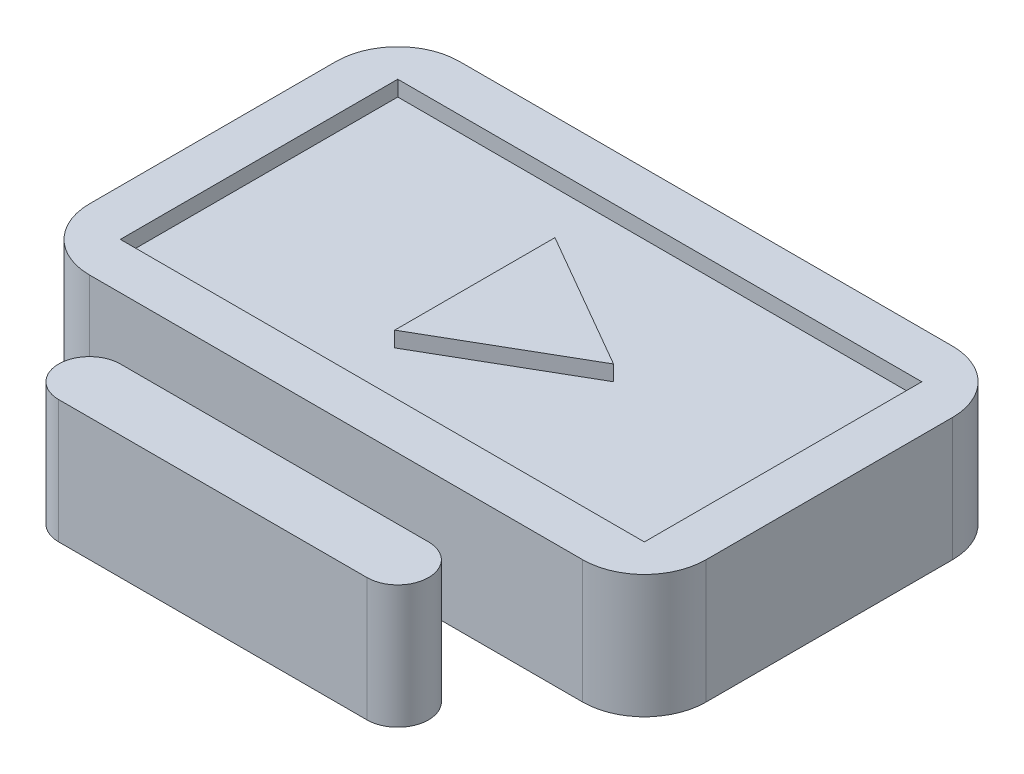
ISO-10303-21;
HEADER;
FILE_DESCRIPTION(('STEP AP214'),'2;1');
FILE_NAME('part.step','',(''),(''),'','','');
FILE_SCHEMA(('AUTOMOTIVE_DESIGN { 1 0 10303 214 1 1 1 1 }'));
ENDSEC;
DATA;
#1=APPLICATION_CONTEXT('core data for automotive mechanical design processes');
#2=APPLICATION_PROTOCOL_DEFINITION('international standard','automotive_design',2000,#1);
#3=PRODUCT_CONTEXT('',#1,'mechanical');
#4=PRODUCT('Part','Part','',(#3));
#5=PRODUCT_RELATED_PRODUCT_CATEGORY('part','',(#4));
#6=PRODUCT_DEFINITION_FORMATION('','',#4);
#7=PRODUCT_DEFINITION_CONTEXT('part definition',#1,'design');
#8=PRODUCT_DEFINITION('design','',#6,#7);
#9=PRODUCT_DEFINITION_SHAPE('','',#8);
#10=(LENGTH_UNIT() NAMED_UNIT(*) SI_UNIT(.MILLI.,.METRE.));
#11=(NAMED_UNIT(*) PLANE_ANGLE_UNIT() SI_UNIT($,.RADIAN.));
#12=(NAMED_UNIT(*) SI_UNIT($,.STERADIAN.) SOLID_ANGLE_UNIT());
#13=UNCERTAINTY_MEASURE_WITH_UNIT(LENGTH_MEASURE(1.E-05),#10,'distance_accuracy_value','');
#14=(GEOMETRIC_REPRESENTATION_CONTEXT(3) GLOBAL_UNCERTAINTY_ASSIGNED_CONTEXT((#13)) GLOBAL_UNIT_ASSIGNED_CONTEXT((#10,
#11,#12)) REPRESENTATION_CONTEXT('',''));
#15=CARTESIAN_POINT('',(0.,0.,0.));
#16=DIRECTION('',(0.,0.,1.));
#17=DIRECTION('',(1.,0.,0.));
#18=AXIS2_PLACEMENT_3D('',#15,#16,#17);
#19=CARTESIAN_POINT('',(-12.7,50.8,0.));
#20=DIRECTION('',(-1.,0.,0.));
#21=DIRECTION('',(0.,0.,1.));
#22=AXIS2_PLACEMENT_3D('',#19,#20,#21);
#23=PLANE('',#22);
#24=DIRECTION('',(0.,-1.,0.));
#25=VECTOR('',#24,1.);
#26=CARTESIAN_POINT('',(-12.7,50.8,-12.7));
#27=LINE('',#26,#25);
#28=CARTESIAN_POINT('',(-12.7,25.4,-12.7));
#29=VERTEX_POINT('',#28);
#30=CARTESIAN_POINT('',(-12.7,0.,-12.7));
#31=VERTEX_POINT('',#30);
#32=EDGE_CURVE('E195',#29,#31,#27,.T.);
#33=ORIENTED_EDGE('',*,*,#32,.F.);
#34=DIRECTION('',(0.,0.,1.));
#35=VECTOR('',#34,1.);
#36=CARTESIAN_POINT('',(-12.7,25.4,-38.1));
#37=LINE('',#36,#35);
#38=CARTESIAN_POINT('',(-12.7,25.4,-38.1));
#39=VERTEX_POINT('',#38);
#40=EDGE_CURVE('E201',#39,#29,#37,.T.);
#41=ORIENTED_EDGE('',*,*,#40,.F.);
#42=DIRECTION('',(0.,-1.,0.));
#43=VECTOR('',#42,1.);
#44=CARTESIAN_POINT('',(-12.7,50.8,-38.1));
#45=LINE('',#44,#43);
#46=CARTESIAN_POINT('',(-12.7,0.,-38.1));
#47=VERTEX_POINT('',#46);
#48=EDGE_CURVE('E213',#39,#47,#45,.T.);
#49=ORIENTED_EDGE('',*,*,#48,.T.);
#50=DIRECTION('',(0.,0.,-1.));
#51=VECTOR('',#50,1.);
#52=CARTESIAN_POINT('',(-12.7,0.,0.));
#53=LINE('',#52,#51);
#54=EDGE_CURVE('E211',#31,#47,#53,.T.);
#55=ORIENTED_EDGE('',*,*,#54,.F.);
#56=EDGE_LOOP('',(#33,#41,#49,#55));
#57=FACE_BOUND('',#56,.T.);
#58=ADVANCED_FACE('F37',(#57),#23,.T.);
#59=CARTESIAN_POINT('',(12.7,50.8,0.));
#60=DIRECTION('',(-1.,0.,0.));
#61=DIRECTION('',(0.,0.,1.));
#62=AXIS2_PLACEMENT_3D('',#59,#60,#61);
#63=PLANE('',#62);
#64=DIRECTION('',(0.,0.,-1.));
#65=VECTOR('',#64,1.);
#66=CARTESIAN_POINT('',(12.7,25.4,-38.1));
#67=LINE('',#66,#65);
#68=CARTESIAN_POINT('',(12.7,25.4,-12.7));
#69=VERTEX_POINT('',#68);
#70=CARTESIAN_POINT('',(12.7,25.4,-38.1));
#71=VERTEX_POINT('',#70);
#72=EDGE_CURVE('E200',#69,#71,#67,.T.);
#73=ORIENTED_EDGE('',*,*,#72,.F.);
#74=DIRECTION('',(0.,-1.,0.));
#75=VECTOR('',#74,1.);
#76=CARTESIAN_POINT('',(12.7,50.8,-12.7));
#77=LINE('',#76,#75);
#78=CARTESIAN_POINT('',(12.7,0.,-12.7));
#79=VERTEX_POINT('',#78);
#80=EDGE_CURVE('E197',#69,#79,#77,.T.);
#81=ORIENTED_EDGE('',*,*,#80,.T.);
#82=DIRECTION('',(0.,0.,-1.));
#83=VECTOR('',#82,1.);
#84=CARTESIAN_POINT('',(12.7,0.,0.));
#85=LINE('',#84,#83);
#86=CARTESIAN_POINT('',(12.7,0.,-38.1));
#87=VERTEX_POINT('',#86);
#88=EDGE_CURVE('E294',#79,#87,#85,.T.);
#89=ORIENTED_EDGE('',*,*,#88,.T.);
#90=DIRECTION('',(0.,-1.,0.));
#91=VECTOR('',#90,1.);
#92=CARTESIAN_POINT('',(12.7,50.8,-38.1));
#93=LINE('',#92,#91);
#94=EDGE_CURVE('E297',#71,#87,#93,.T.);
#95=ORIENTED_EDGE('',*,*,#94,.F.);
#96=EDGE_LOOP('',(#73,#81,#89,#95));
#97=FACE_BOUND('',#96,.T.);
#98=ADVANCED_FACE('F402',(#97),#63,.F.);
#99=CARTESIAN_POINT('',(0.,50.8,0.));
#100=DIRECTION('',(0.,1.,0.));
#101=DIRECTION('',(0.,0.,1.));
#102=AXIS2_PLACEMENT_3D('',#99,#100,#101);
#103=PLANE('',#102);
#104=CARTESIAN_POINT('',(-101.6,50.8,-63.5));
#105=DIRECTION('',(0.,1.,0.));
#106=DIRECTION('',(0.,0.,1.));
#107=AXIS2_PLACEMENT_3D('',#104,#105,#106);
#108=CIRCLE('',#107,25.4);
#109=CARTESIAN_POINT('',(-127.,50.8,-63.5));
#110=VERTEX_POINT('',#109);
#111=CARTESIAN_POINT('',(-101.6,50.8,-38.1));
#112=VERTEX_POINT('',#111);
#113=EDGE_CURVE('E240',#110,#112,#108,.T.);
#114=ORIENTED_EDGE('',*,*,#113,.T.);
#115=DIRECTION('',(1.,0.,0.));
#116=VECTOR('',#115,1.);
#117=CARTESIAN_POINT('',(0.,50.8,-38.1));
#118=LINE('',#117,#116);
#119=CARTESIAN_POINT('',(101.6,50.8,-38.1));
#120=VERTEX_POINT('',#119);
#121=EDGE_CURVE('E299',#112,#120,#118,.T.);
#122=ORIENTED_EDGE('',*,*,#121,.T.);
#123=CARTESIAN_POINT('',(101.6,50.8,-63.5));
#124=DIRECTION('',(0.,1.,0.));
#125=DIRECTION('',(0.,0.,1.));
#126=AXIS2_PLACEMENT_3D('',#123,#124,#125);
#127=CIRCLE('',#126,25.4);
#128=CARTESIAN_POINT('',(127.,50.8,-63.5));
#129=VERTEX_POINT('',#128);
#130=EDGE_CURVE('E243',#120,#129,#127,.T.);
#131=ORIENTED_EDGE('',*,*,#130,.T.);
#132=DIRECTION('',(0.,0.,1.));
#133=VECTOR('',#132,1.);
#134=CARTESIAN_POINT('',(127.,50.8,0.));
#135=LINE('',#134,#133);
#136=CARTESIAN_POINT('',(127.,50.8,-165.1));
#137=VERTEX_POINT('',#136);
#138=EDGE_CURVE('E339',#137,#129,#135,.T.);
#139=ORIENTED_EDGE('',*,*,#138,.F.);
#140=CARTESIAN_POINT('',(101.6,50.8,-165.1));
#141=DIRECTION('',(0.,1.,0.));
#142=DIRECTION('',(0.,0.,1.));
#143=AXIS2_PLACEMENT_3D('',#140,#141,#142);
#144=CIRCLE('',#143,25.4);
#145=CARTESIAN_POINT('',(101.6,50.8,-190.5));
#146=VERTEX_POINT('',#145);
#147=EDGE_CURVE('E236',#137,#146,#144,.T.);
#148=ORIENTED_EDGE('',*,*,#147,.T.);
#149=DIRECTION('',(1.,0.,0.));
#150=VECTOR('',#149,1.);
#151=CARTESIAN_POINT('',(1.04083408558608E-13,50.8,-190.5));
#152=LINE('',#151,#150);
#153=CARTESIAN_POINT('',(-101.6,50.8,-190.5));
#154=VERTEX_POINT('',#153);
#155=EDGE_CURVE('E262',#154,#146,#152,.T.);
#156=ORIENTED_EDGE('',*,*,#155,.F.);
#157=CARTESIAN_POINT('',(-101.6,50.8,-165.1));
#158=DIRECTION('',(0.,1.,0.));
#159=DIRECTION('',(0.,0.,1.));
#160=AXIS2_PLACEMENT_3D('',#157,#158,#159);
#161=CIRCLE('',#160,25.4);
#162=CARTESIAN_POINT('',(-127.,50.8,-165.1));
#163=VERTEX_POINT('',#162);
#164=EDGE_CURVE('E238',#154,#163,#161,.T.);
#165=ORIENTED_EDGE('',*,*,#164,.T.);
#166=DIRECTION('',(0.,0.,1.));
#167=VECTOR('',#166,1.);
#168=CARTESIAN_POINT('',(-127.,50.8,0.));
#169=LINE('',#168,#167);
#170=EDGE_CURVE('E334',#163,#110,#169,.T.);
#171=ORIENTED_EDGE('',*,*,#170,.T.);
#172=EDGE_LOOP('',(#114,#122,#131,#139,#148,#156,#165,#171));
#173=FACE_BOUND('',#172,.T.);
#174=DIRECTION('',(0.,0.,-1.));
#175=VECTOR('',#174,1.);
#176=CARTESIAN_POINT('',(107.95,50.8,-57.1499999999999));
#177=LINE('',#176,#175);
#178=CARTESIAN_POINT('',(107.95,50.8,-57.1499999999999));
#179=VERTEX_POINT('',#178);
#180=CARTESIAN_POINT('',(107.95,50.8,-171.45));
#181=VERTEX_POINT('',#180);
#182=EDGE_CURVE('E362',#179,#181,#177,.T.);
#183=ORIENTED_EDGE('',*,*,#182,.F.);
#184=DIRECTION('',(1.,0.,0.));
#185=VECTOR('',#184,1.);
#186=CARTESIAN_POINT('',(-107.95,50.8,-57.1499999999999));
#187=LINE('',#186,#185);
#188=CARTESIAN_POINT('',(-107.95,50.8,-57.1499999999999));
#189=VERTEX_POINT('',#188);
#190=EDGE_CURVE('E351',#189,#179,#187,.T.);
#191=ORIENTED_EDGE('',*,*,#190,.F.);
#192=DIRECTION('',(0.,0.,1.));
#193=VECTOR('',#192,1.);
#194=CARTESIAN_POINT('',(-107.95,50.8,-57.1499999999999));
#195=LINE('',#194,#193);
#196=CARTESIAN_POINT('',(-107.95,50.8,-171.45));
#197=VERTEX_POINT('',#196);
#198=EDGE_CURVE('E356',#197,#189,#195,.T.);
#199=ORIENTED_EDGE('',*,*,#198,.F.);
#200=DIRECTION('',(-1.,0.,0.));
#201=VECTOR('',#200,1.);
#202=CARTESIAN_POINT('',(-107.95,50.8,-171.45));
#203=LINE('',#202,#201);
#204=EDGE_CURVE('E359',#181,#197,#203,.T.);
#205=ORIENTED_EDGE('',*,*,#204,.F.);
#206=EDGE_LOOP('',(#183,#191,#199,#205));
#207=FACE_BOUND('',#206,.T.);
#208=ADVANCED_FACE('F411',(#173,#207),#103,.T.);
#209=CARTESIAN_POINT('',(0.,44.45,0.));
#210=DIRECTION('',(0.,-1.,0.));
#211=DIRECTION('',(0.,0.,-1.));
#212=AXIS2_PLACEMENT_3D('',#209,#210,#211);
#213=PLANE('',#212);
#214=DIRECTION('',(0.,0.,-1.));
#215=VECTOR('',#214,1.);
#216=CARTESIAN_POINT('',(107.95,44.45,-57.1499999999999));
#217=LINE('',#216,#215);
#218=CARTESIAN_POINT('',(107.95,44.45,-57.1499999999999));
#219=VERTEX_POINT('',#218);
#220=CARTESIAN_POINT('',(107.95,44.45,-171.45));
#221=VERTEX_POINT('',#220);
#222=EDGE_CURVE('E355',#219,#221,#217,.T.);
#223=ORIENTED_EDGE('',*,*,#222,.T.);
#224=DIRECTION('',(-1.,0.,0.));
#225=VECTOR('',#224,1.);
#226=CARTESIAN_POINT('',(-107.95,44.45,-171.45));
#227=LINE('',#226,#225);
#228=CARTESIAN_POINT('',(-107.95,44.45,-171.45));
#229=VERTEX_POINT('',#228);
#230=EDGE_CURVE('E371',#221,#229,#227,.T.);
#231=ORIENTED_EDGE('',*,*,#230,.T.);
#232=DIRECTION('',(0.,0.,1.));
#233=VECTOR('',#232,1.);
#234=CARTESIAN_POINT('',(-107.95,44.45,-57.1499999999999));
#235=LINE('',#234,#233);
#236=CARTESIAN_POINT('',(-107.95,44.45,-57.1499999999999));
#237=VERTEX_POINT('',#236);
#238=EDGE_CURVE('E368',#229,#237,#235,.T.);
#239=ORIENTED_EDGE('',*,*,#238,.T.);
#240=DIRECTION('',(1.,0.,0.));
#241=VECTOR('',#240,1.);
#242=CARTESIAN_POINT('',(-107.95,44.45,-57.1499999999999));
#243=LINE('',#242,#241);
#244=EDGE_CURVE('E346',#237,#219,#243,.T.);
#245=ORIENTED_EDGE('',*,*,#244,.T.);
#246=EDGE_LOOP('',(#223,#231,#239,#245));
#247=FACE_BOUND('',#246,.T.);
#248=DIRECTION('',(0.866025403784438,0.,-0.500000000000001));
#249=VECTOR('',#248,1.);
#250=CARTESIAN_POINT('',(-19.05,44.45,-81.3044321158129));
#251=LINE('',#250,#249);
#252=CARTESIAN_POINT('',(-19.05,44.45,-81.3044321158129));
#253=VERTEX_POINT('',#252);
#254=CARTESIAN_POINT('',(38.1,44.45,-114.3));
#255=VERTEX_POINT('',#254);
#256=EDGE_CURVE('E379',#253,#255,#251,.T.);
#257=ORIENTED_EDGE('',*,*,#256,.F.);
#258=DIRECTION('',(0.,0.,1.));
#259=VECTOR('',#258,1.);
#260=CARTESIAN_POINT('',(-19.05,44.45,-147.295567884187));
#261=LINE('',#260,#259);
#262=CARTESIAN_POINT('',(-19.05,44.45,-147.295567884187));
#263=VERTEX_POINT('',#262);
#264=EDGE_CURVE('E56',#263,#253,#261,.T.);
#265=ORIENTED_EDGE('',*,*,#264,.F.);
#266=DIRECTION('',(-0.866025403784439,0.,-0.5));
#267=VECTOR('',#266,1.);
#268=CARTESIAN_POINT('',(38.1,44.45,-114.3));
#269=LINE('',#268,#267);
#270=EDGE_CURVE('E52',#255,#263,#269,.T.);
#271=ORIENTED_EDGE('',*,*,#270,.F.);
#272=EDGE_LOOP('',(#257,#265,#271));
#273=FACE_BOUND('',#272,.T.);
#274=ADVANCED_FACE('F443',(#247,#273),#213,.F.);
#275=CARTESIAN_POINT('',(127.,50.8,0.));
#276=DIRECTION('',(1.,0.,0.));
#277=DIRECTION('',(0.,0.,-1.));
#278=AXIS2_PLACEMENT_3D('',#275,#276,#277);
#279=PLANE('',#278);
#280=ORIENTED_EDGE('',*,*,#138,.T.);
#281=DIRECTION('',(0.,-1.,0.));
#282=VECTOR('',#281,1.);
#283=CARTESIAN_POINT('',(127.,0.,-63.5));
#284=LINE('',#283,#282);
#285=CARTESIAN_POINT('',(127.,0.,-63.5));
#286=VERTEX_POINT('',#285);
#287=EDGE_CURVE('E223',#129,#286,#284,.T.);
#288=ORIENTED_EDGE('',*,*,#287,.T.);
#289=DIRECTION('',(0.,0.,1.));
#290=VECTOR('',#289,1.);
#291=CARTESIAN_POINT('',(127.,0.,0.));
#292=LINE('',#291,#290);
#293=CARTESIAN_POINT('',(127.,0.,-165.1));
#294=VERTEX_POINT('',#293);
#295=EDGE_CURVE('E271',#294,#286,#292,.T.);
#296=ORIENTED_EDGE('',*,*,#295,.F.);
#297=DIRECTION('',(0.,-1.,0.));
#298=VECTOR('',#297,1.);
#299=CARTESIAN_POINT('',(127.,50.8,-165.1));
#300=LINE('',#299,#298);
#301=EDGE_CURVE('E216',#294,#137,#300,.F.);
#302=ORIENTED_EDGE('',*,*,#301,.T.);
#303=EDGE_LOOP('',(#280,#288,#296,#302));
#304=FACE_BOUND('',#303,.T.);
#305=ADVANCED_FACE('F414',(#304),#279,.T.);
#306=CARTESIAN_POINT('',(1.04083408558608E-13,50.8,-190.5));
#307=DIRECTION('',(0.,0.,-1.));
#308=DIRECTION('',(-1.,0.,0.));
#309=AXIS2_PLACEMENT_3D('',#306,#307,#308);
#310=PLANE('',#309);
#311=DIRECTION('',(1.,0.,0.));
#312=VECTOR('',#311,1.);
#313=CARTESIAN_POINT('',(1.04083408558608E-13,0.,-190.5));
#314=LINE('',#313,#312);
#315=CARTESIAN_POINT('',(-101.6,0.,-190.5));
#316=VERTEX_POINT('',#315);
#317=CARTESIAN_POINT('',(101.6,0.,-190.5));
#318=VERTEX_POINT('',#317);
#319=EDGE_CURVE('E259',#316,#318,#314,.T.);
#320=ORIENTED_EDGE('',*,*,#319,.F.);
#321=DIRECTION('',(0.,-1.,0.));
#322=VECTOR('',#321,1.);
#323=CARTESIAN_POINT('',(-101.6,50.8,-190.5));
#324=LINE('',#323,#322);
#325=EDGE_CURVE('E11',#316,#154,#324,.F.);
#326=ORIENTED_EDGE('',*,*,#325,.T.);
#327=ORIENTED_EDGE('',*,*,#155,.T.);
#328=DIRECTION('',(0.,-1.,0.));
#329=VECTOR('',#328,1.);
#330=CARTESIAN_POINT('',(101.6,50.8,-190.5));
#331=LINE('',#330,#329);
#332=EDGE_CURVE('E45',#146,#318,#331,.T.);
#333=ORIENTED_EDGE('',*,*,#332,.T.);
#334=EDGE_LOOP('',(#320,#326,#327,#333));
#335=FACE_BOUND('',#334,.T.);
#336=ADVANCED_FACE('F258',(#335),#310,.T.);
#337=CARTESIAN_POINT('',(-127.,50.8,0.));
#338=DIRECTION('',(1.,0.,0.));
#339=DIRECTION('',(0.,0.,-1.));
#340=AXIS2_PLACEMENT_3D('',#337,#338,#339);
#341=PLANE('',#340);
#342=DIRECTION('',(0.,0.,1.));
#343=VECTOR('',#342,1.);
#344=CARTESIAN_POINT('',(-127.,0.,0.));
#345=LINE('',#344,#343);
#346=CARTESIAN_POINT('',(-127.,0.,-165.1));
#347=VERTEX_POINT('',#346);
#348=CARTESIAN_POINT('',(-127.,0.,-63.5));
#349=VERTEX_POINT('',#348);
#350=EDGE_CURVE('E270',#347,#349,#345,.T.);
#351=ORIENTED_EDGE('',*,*,#350,.T.);
#352=DIRECTION('',(0.,-1.,0.));
#353=VECTOR('',#352,1.);
#354=CARTESIAN_POINT('',(-127.,50.8,-63.5));
#355=LINE('',#354,#353);
#356=EDGE_CURVE('E251',#349,#110,#355,.F.);
#357=ORIENTED_EDGE('',*,*,#356,.T.);
#358=ORIENTED_EDGE('',*,*,#170,.F.);
#359=DIRECTION('',(0.,-1.,0.));
#360=VECTOR('',#359,1.);
#361=CARTESIAN_POINT('',(-127.,0.,-165.1));
#362=LINE('',#361,#360);
#363=EDGE_CURVE('E248',#163,#347,#362,.T.);
#364=ORIENTED_EDGE('',*,*,#363,.T.);
#365=EDGE_LOOP('',(#351,#357,#358,#364));
#366=FACE_BOUND('',#365,.T.);
#367=ADVANCED_FACE('F422',(#366),#341,.F.);
#368=CARTESIAN_POINT('',(-63.5,50.8,0.));
#369=DIRECTION('',(0.,-1.,0.));
#370=DIRECTION('',(0.,0.,-1.));
#371=AXIS2_PLACEMENT_3D('',#368,#369,#370);
#372=CYLINDRICAL_SURFACE('',#371,12.7);
#373=CARTESIAN_POINT('',(-63.5,0.,0.));
#374=DIRECTION('',(0.,1.,0.));
#375=DIRECTION('',(0.,0.,1.));
#376=AXIS2_PLACEMENT_3D('',#373,#374,#375);
#377=CIRCLE('',#376,12.7);
#378=CARTESIAN_POINT('',(-63.5,0.,-12.7));
#379=VERTEX_POINT('',#378);
#380=CARTESIAN_POINT('',(-63.5,0.,12.7));
#381=VERTEX_POINT('',#380);
#382=EDGE_CURVE('E286',#379,#381,#377,.T.);
#383=ORIENTED_EDGE('',*,*,#382,.T.);
#384=DIRECTION('',(0.,-1.,0.));
#385=VECTOR('',#384,1.);
#386=CARTESIAN_POINT('',(-63.5,50.8,12.7));
#387=LINE('',#386,#385);
#388=CARTESIAN_POINT('',(-63.5,50.8,12.7));
#389=VERTEX_POINT('',#388);
#390=EDGE_CURVE('E218',#389,#381,#387,.T.);
#391=ORIENTED_EDGE('',*,*,#390,.F.);
#392=CARTESIAN_POINT('',(-63.5,50.8,0.));
#393=DIRECTION('',(0.,1.,0.));
#394=DIRECTION('',(0.,0.,1.));
#395=AXIS2_PLACEMENT_3D('',#392,#393,#394);
#396=CIRCLE('',#395,12.7);
#397=CARTESIAN_POINT('',(-63.5,50.8,-12.7));
#398=VERTEX_POINT('',#397);
#399=EDGE_CURVE('E329',#398,#389,#396,.T.);
#400=ORIENTED_EDGE('',*,*,#399,.F.);
#401=DIRECTION('',(0.,-1.,0.));
#402=VECTOR('',#401,1.);
#403=CARTESIAN_POINT('',(-63.5,50.8,-12.7));
#404=LINE('',#403,#402);
#405=EDGE_CURVE('E214',#398,#379,#404,.T.);
#406=ORIENTED_EDGE('',*,*,#405,.T.);
#407=EDGE_LOOP('',(#383,#391,#400,#406));
#408=FACE_BOUND('',#407,.T.);
#409=ADVANCED_FACE('F429',(#408),#372,.T.);
#410=CARTESIAN_POINT('',(0.,50.8,12.7));
#411=DIRECTION('',(0.,0.,-1.));
#412=DIRECTION('',(-1.,0.,0.));
#413=AXIS2_PLACEMENT_3D('',#410,#411,#412);
#414=PLANE('',#413);
#415=DIRECTION('',(1.,0.,0.));
#416=VECTOR('',#415,1.);
#417=CARTESIAN_POINT('',(0.,0.,12.7));
#418=LINE('',#417,#416);
#419=CARTESIAN_POINT('',(63.5,0.,12.7));
#420=VERTEX_POINT('',#419);
#421=EDGE_CURVE('E289',#381,#420,#418,.T.);
#422=ORIENTED_EDGE('',*,*,#421,.T.);
#423=DIRECTION('',(0.,-1.,0.));
#424=VECTOR('',#423,1.);
#425=CARTESIAN_POINT('',(63.5,50.8,12.7));
#426=LINE('',#425,#424);
#427=CARTESIAN_POINT('',(63.5,50.8,12.7));
#428=VERTEX_POINT('',#427);
#429=EDGE_CURVE('E303',#428,#420,#426,.T.);
#430=ORIENTED_EDGE('',*,*,#429,.F.);
#431=DIRECTION('',(1.,0.,0.));
#432=VECTOR('',#431,1.);
#433=CARTESIAN_POINT('',(0.,50.8,12.7));
#434=LINE('',#433,#432);
#435=EDGE_CURVE('E312',#389,#428,#434,.T.);
#436=ORIENTED_EDGE('',*,*,#435,.F.);
#437=ORIENTED_EDGE('',*,*,#390,.T.);
#438=EDGE_LOOP('',(#422,#430,#436,#437));
#439=FACE_BOUND('',#438,.T.);
#440=ADVANCED_FACE('F310',(#439),#414,.F.);
#441=CARTESIAN_POINT('',(63.5,50.8,0.));
#442=DIRECTION('',(0.,-1.,0.));
#443=DIRECTION('',(0.,0.,-1.));
#444=AXIS2_PLACEMENT_3D('',#441,#442,#443);
#445=CYLINDRICAL_SURFACE('',#444,12.7);
#446=CARTESIAN_POINT('',(63.5,0.,0.));
#447=DIRECTION('',(0.,1.,0.));
#448=DIRECTION('',(0.,0.,1.));
#449=AXIS2_PLACEMENT_3D('',#446,#447,#448);
#450=CIRCLE('',#449,12.7);
#451=CARTESIAN_POINT('',(63.5,0.,-12.7));
#452=VERTEX_POINT('',#451);
#453=EDGE_CURVE('E291',#420,#452,#450,.T.);
#454=ORIENTED_EDGE('',*,*,#453,.T.);
#455=DIRECTION('',(0.,-1.,0.));
#456=VECTOR('',#455,1.);
#457=CARTESIAN_POINT('',(63.5,50.8,-12.7));
#458=LINE('',#457,#456);
#459=CARTESIAN_POINT('',(63.5,50.8,-12.7));
#460=VERTEX_POINT('',#459);
#461=EDGE_CURVE('E301',#460,#452,#458,.T.);
#462=ORIENTED_EDGE('',*,*,#461,.F.);
#463=CARTESIAN_POINT('',(63.5,50.8,0.));
#464=DIRECTION('',(0.,1.,0.));
#465=DIRECTION('',(0.,0.,1.));
#466=AXIS2_PLACEMENT_3D('',#463,#464,#465);
#467=CIRCLE('',#466,12.7);
#468=EDGE_CURVE('E324',#428,#460,#467,.T.);
#469=ORIENTED_EDGE('',*,*,#468,.F.);
#470=ORIENTED_EDGE('',*,*,#429,.T.);
#471=EDGE_LOOP('',(#454,#462,#469,#470));
#472=FACE_BOUND('',#471,.T.);
#473=ADVANCED_FACE('F321',(#472),#445,.T.);
#474=CARTESIAN_POINT('',(0.,50.8,-12.7));
#475=DIRECTION('',(0.,0.,-1.));
#476=DIRECTION('',(-1.,0.,0.));
#477=AXIS2_PLACEMENT_3D('',#474,#475,#476);
#478=PLANE('',#477);
#479=DIRECTION('',(1.,0.,0.));
#480=VECTOR('',#479,1.);
#481=CARTESIAN_POINT('',(0.,0.,-12.7));
#482=LINE('',#481,#480);
#483=EDGE_CURVE('E287',#79,#452,#482,.T.);
#484=ORIENTED_EDGE('',*,*,#483,.F.);
#485=ORIENTED_EDGE('',*,*,#80,.F.);
#486=DIRECTION('',(1.,0.,0.));
#487=VECTOR('',#486,1.);
#488=CARTESIAN_POINT('',(-12.7,25.4,-12.7));
#489=LINE('',#488,#487);
#490=EDGE_CURVE('E189',#29,#69,#489,.T.);
#491=ORIENTED_EDGE('',*,*,#490,.F.);
#492=ORIENTED_EDGE('',*,*,#32,.T.);
#493=EDGE_CURVE('E284',#379,#31,#482,.T.);
#494=ORIENTED_EDGE('',*,*,#493,.F.);
#495=ORIENTED_EDGE('',*,*,#405,.F.);
#496=DIRECTION('',(1.,0.,0.));
#497=VECTOR('',#496,1.);
#498=CARTESIAN_POINT('',(0.,50.8,-12.7));
#499=LINE('',#498,#497);
#500=EDGE_CURVE('E333',#398,#460,#499,.T.);
#501=ORIENTED_EDGE('',*,*,#500,.T.);
#502=ORIENTED_EDGE('',*,*,#461,.T.);
#503=EDGE_LOOP('',(#484,#485,#491,#492,#494,#495,#501,#502));
#504=FACE_BOUND('',#503,.T.);
#505=ADVANCED_FACE('F192',(#504),#478,.T.);
#506=CARTESIAN_POINT('',(0.,50.8,-38.1));
#507=DIRECTION('',(0.,0.,-1.));
#508=DIRECTION('',(-1.,0.,0.));
#509=AXIS2_PLACEMENT_3D('',#506,#507,#508);
#510=PLANE('',#509);
#511=DIRECTION('',(1.,0.,0.));
#512=VECTOR('',#511,1.);
#513=CARTESIAN_POINT('',(0.,0.,-38.1));
#514=LINE('',#513,#512);
#515=CARTESIAN_POINT('',(101.6,0.,-38.1));
#516=VERTEX_POINT('',#515);
#517=EDGE_CURVE('E282',#87,#516,#514,.T.);
#518=ORIENTED_EDGE('',*,*,#517,.T.);
#519=DIRECTION('',(0.,-1.,0.));
#520=VECTOR('',#519,1.);
#521=CARTESIAN_POINT('',(101.6,50.8,-38.1));
#522=LINE('',#521,#520);
#523=EDGE_CURVE('E234',#516,#120,#522,.F.);
#524=ORIENTED_EDGE('',*,*,#523,.T.);
#525=ORIENTED_EDGE('',*,*,#121,.F.);
#526=DIRECTION('',(0.,-1.,0.));
#527=VECTOR('',#526,1.);
#528=CARTESIAN_POINT('',(-101.6,50.8,-38.1));
#529=LINE('',#528,#527);
#530=CARTESIAN_POINT('',(-101.6,0.,-38.1));
#531=VERTEX_POINT('',#530);
#532=EDGE_CURVE('E245',#112,#531,#529,.T.);
#533=ORIENTED_EDGE('',*,*,#532,.T.);
#534=EDGE_CURVE('E274',#531,#47,#514,.T.);
#535=ORIENTED_EDGE('',*,*,#534,.T.);
#536=ORIENTED_EDGE('',*,*,#48,.F.);
#537=DIRECTION('',(-1.,0.,0.));
#538=VECTOR('',#537,1.);
#539=CARTESIAN_POINT('',(-12.7,25.4,-38.1));
#540=LINE('',#539,#538);
#541=EDGE_CURVE('E206',#71,#39,#540,.T.);
#542=ORIENTED_EDGE('',*,*,#541,.F.);
#543=ORIENTED_EDGE('',*,*,#94,.T.);
#544=EDGE_LOOP('',(#518,#524,#525,#533,#535,#536,#542,#543));
#545=FACE_BOUND('',#544,.T.);
#546=ADVANCED_FACE('F401',(#545),#510,.F.);
#547=ORIENTED_EDGE('',*,*,#468,.T.);
#548=ORIENTED_EDGE('',*,*,#500,.F.);
#549=ORIENTED_EDGE('',*,*,#399,.T.);
#550=ORIENTED_EDGE('',*,*,#435,.T.);
#551=EDGE_LOOP('',(#547,#548,#549,#550));
#552=FACE_BOUND('',#551,.T.);
#553=ADVANCED_FACE('F430',(#552),#103,.T.);
#554=CARTESIAN_POINT('',(0.,0.,0.));
#555=DIRECTION('',(0.,1.,0.));
#556=DIRECTION('',(0.,0.,1.));
#557=AXIS2_PLACEMENT_3D('',#554,#555,#556);
#558=PLANE('',#557);
#559=ORIENTED_EDGE('',*,*,#295,.T.);
#560=CARTESIAN_POINT('',(101.6,0.,-63.5));
#561=DIRECTION('',(0.,1.,0.));
#562=DIRECTION('',(0.,0.,1.));
#563=AXIS2_PLACEMENT_3D('',#560,#561,#562);
#564=CIRCLE('',#563,25.4);
#565=EDGE_CURVE('E232',#286,#516,#564,.F.);
#566=ORIENTED_EDGE('',*,*,#565,.T.);
#567=ORIENTED_EDGE('',*,*,#517,.F.);
#568=ORIENTED_EDGE('',*,*,#88,.F.);
#569=ORIENTED_EDGE('',*,*,#483,.T.);
#570=ORIENTED_EDGE('',*,*,#453,.F.);
#571=ORIENTED_EDGE('',*,*,#421,.F.);
#572=ORIENTED_EDGE('',*,*,#382,.F.);
#573=ORIENTED_EDGE('',*,*,#493,.T.);
#574=ORIENTED_EDGE('',*,*,#54,.T.);
#575=ORIENTED_EDGE('',*,*,#534,.F.);
#576=CARTESIAN_POINT('',(-101.6,0.,-63.5));
#577=DIRECTION('',(0.,1.,0.));
#578=DIRECTION('',(0.,0.,1.));
#579=AXIS2_PLACEMENT_3D('',#576,#577,#578);
#580=CIRCLE('',#579,25.4);
#581=EDGE_CURVE('E230',#531,#349,#580,.F.);
#582=ORIENTED_EDGE('',*,*,#581,.T.);
#583=ORIENTED_EDGE('',*,*,#350,.F.);
#584=CARTESIAN_POINT('',(-101.6,0.,-165.1));
#585=DIRECTION('',(0.,1.,0.));
#586=DIRECTION('',(0.,0.,1.));
#587=AXIS2_PLACEMENT_3D('',#584,#585,#586);
#588=CIRCLE('',#587,25.4);
#589=EDGE_CURVE('E228',#347,#316,#588,.F.);
#590=ORIENTED_EDGE('',*,*,#589,.T.);
#591=ORIENTED_EDGE('',*,*,#319,.T.);
#592=CARTESIAN_POINT('',(101.6,0.,-165.1));
#593=DIRECTION('',(0.,1.,0.));
#594=DIRECTION('',(0.,0.,1.));
#595=AXIS2_PLACEMENT_3D('',#592,#593,#594);
#596=CIRCLE('',#595,25.4);
#597=EDGE_CURVE('E226',#318,#294,#596,.F.);
#598=ORIENTED_EDGE('',*,*,#597,.T.);
#599=EDGE_LOOP('',(#559,#566,#567,#568,#569,#570,#571,#572,#573,#574,#575,#582,#583,#590,#591,#598));
#600=FACE_BOUND('',#599,.T.);
#601=ADVANCED_FACE('F267',(#600),#558,.F.);
#602=CARTESIAN_POINT('',(101.6,50.8,-63.5));
#603=DIRECTION('',(0.,1.,0.));
#604=DIRECTION('',(0.,0.,1.));
#605=AXIS2_PLACEMENT_3D('',#602,#603,#604);
#606=CYLINDRICAL_SURFACE('',#605,25.4);
#607=ORIENTED_EDGE('',*,*,#130,.F.);
#608=ORIENTED_EDGE('',*,*,#523,.F.);
#609=ORIENTED_EDGE('',*,*,#565,.F.);
#610=ORIENTED_EDGE('',*,*,#287,.F.);
#611=EDGE_LOOP('',(#607,#608,#609,#610));
#612=FACE_BOUND('',#611,.T.);
#613=ADVANCED_FACE('F407',(#612),#606,.T.);
#614=CARTESIAN_POINT('',(-101.6,50.8,-63.5));
#615=DIRECTION('',(0.,-1.,0.));
#616=DIRECTION('',(0.,0.,-1.));
#617=AXIS2_PLACEMENT_3D('',#614,#615,#616);
#618=CYLINDRICAL_SURFACE('',#617,25.4);
#619=ORIENTED_EDGE('',*,*,#113,.F.);
#620=ORIENTED_EDGE('',*,*,#356,.F.);
#621=ORIENTED_EDGE('',*,*,#581,.F.);
#622=ORIENTED_EDGE('',*,*,#532,.F.);
#623=EDGE_LOOP('',(#619,#620,#621,#622));
#624=FACE_BOUND('',#623,.T.);
#625=ADVANCED_FACE('F428',(#624),#618,.T.);
#626=CARTESIAN_POINT('',(-101.6,50.8,-165.1));
#627=DIRECTION('',(0.,1.,0.));
#628=DIRECTION('',(0.,0.,1.));
#629=AXIS2_PLACEMENT_3D('',#626,#627,#628);
#630=CYLINDRICAL_SURFACE('',#629,25.4);
#631=ORIENTED_EDGE('',*,*,#164,.F.);
#632=ORIENTED_EDGE('',*,*,#325,.F.);
#633=ORIENTED_EDGE('',*,*,#589,.F.);
#634=ORIENTED_EDGE('',*,*,#363,.F.);
#635=EDGE_LOOP('',(#631,#632,#633,#634));
#636=FACE_BOUND('',#635,.T.);
#637=ADVANCED_FACE('F420',(#636),#630,.T.);
#638=CARTESIAN_POINT('',(101.6,50.8,-165.1));
#639=DIRECTION('',(0.,-1.,0.));
#640=DIRECTION('',(0.,0.,-1.));
#641=AXIS2_PLACEMENT_3D('',#638,#639,#640);
#642=CYLINDRICAL_SURFACE('',#641,25.4);
#643=ORIENTED_EDGE('',*,*,#147,.F.);
#644=ORIENTED_EDGE('',*,*,#301,.F.);
#645=ORIENTED_EDGE('',*,*,#597,.F.);
#646=ORIENTED_EDGE('',*,*,#332,.F.);
#647=EDGE_LOOP('',(#643,#644,#645,#646));
#648=FACE_BOUND('',#647,.T.);
#649=ADVANCED_FACE('F39',(#648),#642,.T.);
#650=CARTESIAN_POINT('',(107.95,44.45,-57.1499999999999));
#651=DIRECTION('',(1.,0.,0.));
#652=DIRECTION('',(0.,0.,-1.));
#653=AXIS2_PLACEMENT_3D('',#650,#651,#652);
#654=PLANE('',#653);
#655=ORIENTED_EDGE('',*,*,#182,.T.);
#656=DIRECTION('',(0.,1.,0.));
#657=VECTOR('',#656,1.);
#658=CARTESIAN_POINT('',(107.95,44.45,-171.45));
#659=LINE('',#658,#657);
#660=EDGE_CURVE('E342',#221,#181,#659,.T.);
#661=ORIENTED_EDGE('',*,*,#660,.F.);
#662=ORIENTED_EDGE('',*,*,#222,.F.);
#663=DIRECTION('',(0.,1.,0.));
#664=VECTOR('',#663,1.);
#665=CARTESIAN_POINT('',(107.95,44.45,-57.1499999999999));
#666=LINE('',#665,#664);
#667=EDGE_CURVE('E276',#219,#179,#666,.T.);
#668=ORIENTED_EDGE('',*,*,#667,.T.);
#669=EDGE_LOOP('',(#655,#661,#662,#668));
#670=FACE_BOUND('',#669,.T.);
#671=ADVANCED_FACE('F467',(#670),#654,.F.);
#672=CARTESIAN_POINT('',(-107.95,44.45,-57.1499999999999));
#673=DIRECTION('',(0.,0.,1.));
#674=DIRECTION('',(1.,0.,0.));
#675=AXIS2_PLACEMENT_3D('',#672,#673,#674);
#676=PLANE('',#675);
#677=ORIENTED_EDGE('',*,*,#190,.T.);
#678=ORIENTED_EDGE('',*,*,#667,.F.);
#679=ORIENTED_EDGE('',*,*,#244,.F.);
#680=DIRECTION('',(0.,1.,0.));
#681=VECTOR('',#680,1.);
#682=CARTESIAN_POINT('',(-107.95,44.45,-57.1499999999999));
#683=LINE('',#682,#681);
#684=EDGE_CURVE('E348',#237,#189,#683,.T.);
#685=ORIENTED_EDGE('',*,*,#684,.T.);
#686=EDGE_LOOP('',(#677,#678,#679,#685));
#687=FACE_BOUND('',#686,.T.);
#688=ADVANCED_FACE('F471',(#687),#676,.F.);
#689=CARTESIAN_POINT('',(-107.95,44.45,-57.1499999999999));
#690=DIRECTION('',(-1.,0.,0.));
#691=DIRECTION('',(0.,0.,1.));
#692=AXIS2_PLACEMENT_3D('',#689,#690,#691);
#693=PLANE('',#692);
#694=ORIENTED_EDGE('',*,*,#198,.T.);
#695=ORIENTED_EDGE('',*,*,#684,.F.);
#696=ORIENTED_EDGE('',*,*,#238,.F.);
#697=DIRECTION('',(0.,1.,0.));
#698=VECTOR('',#697,1.);
#699=CARTESIAN_POINT('',(-107.95,44.45,-171.45));
#700=LINE('',#699,#698);
#701=EDGE_CURVE('E345',#229,#197,#700,.T.);
#702=ORIENTED_EDGE('',*,*,#701,.T.);
#703=EDGE_LOOP('',(#694,#695,#696,#702));
#704=FACE_BOUND('',#703,.T.);
#705=ADVANCED_FACE('F476',(#704),#693,.F.);
#706=CARTESIAN_POINT('',(-107.95,44.45,-171.45));
#707=DIRECTION('',(0.,0.,-1.));
#708=DIRECTION('',(-1.,0.,0.));
#709=AXIS2_PLACEMENT_3D('',#706,#707,#708);
#710=PLANE('',#709);
#711=ORIENTED_EDGE('',*,*,#204,.T.);
#712=ORIENTED_EDGE('',*,*,#701,.F.);
#713=ORIENTED_EDGE('',*,*,#230,.F.);
#714=ORIENTED_EDGE('',*,*,#660,.T.);
#715=EDGE_LOOP('',(#711,#712,#713,#714));
#716=FACE_BOUND('',#715,.T.);
#717=ADVANCED_FACE('F480',(#716),#710,.F.);
#718=CARTESIAN_POINT('',(-19.05,138.098066988909,-81.3044321158129));
#719=DIRECTION('',(-0.500000000000001,0.,-0.866025403784438));
#720=DIRECTION('',(-0.866025403784438,0.,0.500000000000001));
#721=AXIS2_PLACEMENT_3D('',#718,#719,#720);
#722=PLANE('',#721);
#723=DIRECTION('',(0.866025403784438,0.,-0.500000000000001));
#724=VECTOR('',#723,1.);
#725=CARTESIAN_POINT('',(-19.05,50.8,-81.3044321158129));
#726=LINE('',#725,#724);
#727=CARTESIAN_POINT('',(-19.05,50.8,-81.3044321158129));
#728=VERTEX_POINT('',#727);
#729=CARTESIAN_POINT('',(38.1,50.8,-114.3));
#730=VERTEX_POINT('',#729);
#731=EDGE_CURVE('E387',#728,#730,#726,.T.);
#732=ORIENTED_EDGE('',*,*,#731,.F.);
#733=DIRECTION('',(0.,-1.,0.));
#734=VECTOR('',#733,1.);
#735=CARTESIAN_POINT('',(-19.05,138.098066988909,-81.3044321158129));
#736=LINE('',#735,#734);
#737=EDGE_CURVE('E376',#728,#253,#736,.T.);
#738=ORIENTED_EDGE('',*,*,#737,.T.);
#739=ORIENTED_EDGE('',*,*,#256,.T.);
#740=DIRECTION('',(0.,-1.,0.));
#741=VECTOR('',#740,1.);
#742=CARTESIAN_POINT('',(38.1,138.098066988909,-114.3));
#743=LINE('',#742,#741);
#744=EDGE_CURVE('E382',#730,#255,#743,.T.);
#745=ORIENTED_EDGE('',*,*,#744,.F.);
#746=EDGE_LOOP('',(#732,#738,#739,#745));
#747=FACE_BOUND('',#746,.T.);
#748=ADVANCED_FACE('F483',(#747),#722,.F.);
#749=CARTESIAN_POINT('',(38.1,138.098066988909,-114.3));
#750=DIRECTION('',(-0.5,0.,0.866025403784439));
#751=DIRECTION('',(0.866025403784439,0.,0.5));
#752=AXIS2_PLACEMENT_3D('',#749,#750,#751);
#753=PLANE('',#752);
#754=DIRECTION('',(-0.866025403784439,0.,-0.5));
#755=VECTOR('',#754,1.);
#756=CARTESIAN_POINT('',(38.1,50.8,-114.3));
#757=LINE('',#756,#755);
#758=CARTESIAN_POINT('',(-19.05,50.8,-147.295567884187));
#759=VERTEX_POINT('',#758);
#760=EDGE_CURVE('E364',#730,#759,#757,.T.);
#761=ORIENTED_EDGE('',*,*,#760,.F.);
#762=ORIENTED_EDGE('',*,*,#744,.T.);
#763=ORIENTED_EDGE('',*,*,#270,.T.);
#764=DIRECTION('',(0.,-1.,0.));
#765=VECTOR('',#764,1.);
#766=CARTESIAN_POINT('',(-19.05,138.098066988909,-147.295567884187));
#767=LINE('',#766,#765);
#768=EDGE_CURVE('E380',#759,#263,#767,.T.);
#769=ORIENTED_EDGE('',*,*,#768,.F.);
#770=EDGE_LOOP('',(#761,#762,#763,#769));
#771=FACE_BOUND('',#770,.T.);
#772=ADVANCED_FACE('F498',(#771),#753,.F.);
#773=CARTESIAN_POINT('',(-19.05,138.098066988909,-147.295567884187));
#774=DIRECTION('',(1.,0.,0.));
#775=DIRECTION('',(0.,0.,-1.));
#776=AXIS2_PLACEMENT_3D('',#773,#774,#775);
#777=PLANE('',#776);
#778=DIRECTION('',(0.,0.,1.));
#779=VECTOR('',#778,1.);
#780=CARTESIAN_POINT('',(-19.05,50.8,-147.295567884187));
#781=LINE('',#780,#779);
#782=EDGE_CURVE('E384',#759,#728,#781,.T.);
#783=ORIENTED_EDGE('',*,*,#782,.F.);
#784=ORIENTED_EDGE('',*,*,#768,.T.);
#785=ORIENTED_EDGE('',*,*,#264,.T.);
#786=ORIENTED_EDGE('',*,*,#737,.F.);
#787=EDGE_LOOP('',(#783,#784,#785,#786));
#788=FACE_BOUND('',#787,.T.);
#789=ADVANCED_FACE('F494',(#788),#777,.F.);
#790=CARTESIAN_POINT('',(0.,50.8,0.));
#791=DIRECTION('',(0.,1.,0.));
#792=DIRECTION('',(0.,0.,1.));
#793=AXIS2_PLACEMENT_3D('',#790,#791,#792);
#794=PLANE('',#793);
#795=ORIENTED_EDGE('',*,*,#782,.T.);
#796=ORIENTED_EDGE('',*,*,#731,.T.);
#797=ORIENTED_EDGE('',*,*,#760,.T.);
#798=EDGE_LOOP('',(#795,#796,#797));
#799=FACE_BOUND('',#798,.T.);
#800=ADVANCED_FACE('F491',(#799),#794,.T.);
#801=CARTESIAN_POINT('',(0.,25.4,0.));
#802=DIRECTION('',(0.,1.,0.));
#803=DIRECTION('',(0.,0.,1.));
#804=AXIS2_PLACEMENT_3D('',#801,#802,#803);
#805=PLANE('',#804);
#806=ORIENTED_EDGE('',*,*,#40,.T.);
#807=ORIENTED_EDGE('',*,*,#490,.T.);
#808=ORIENTED_EDGE('',*,*,#72,.T.);
#809=ORIENTED_EDGE('',*,*,#541,.T.);
#810=EDGE_LOOP('',(#806,#807,#808,#809));
#811=FACE_BOUND('',#810,.T.);
#812=ADVANCED_FACE('F204',(#811),#805,.T.);
#813=CLOSED_SHELL('',(#58,#98,#208,#274,#305,#336,#367,#409,#440,#473,#505,#546,#553,#601,#613,
#625,#637,#649,#671,#688,#705,#717,#748,#772,#789,#800,#812));
#814=MANIFOLD_SOLID_BREP('B2',#813);
#815=ADVANCED_BREP_SHAPE_REPRESENTATION('',(#18,#814),#14);
#816=SHAPE_DEFINITION_REPRESENTATION(#9,#815);
ENDSEC;
END-ISO-10303-21;
